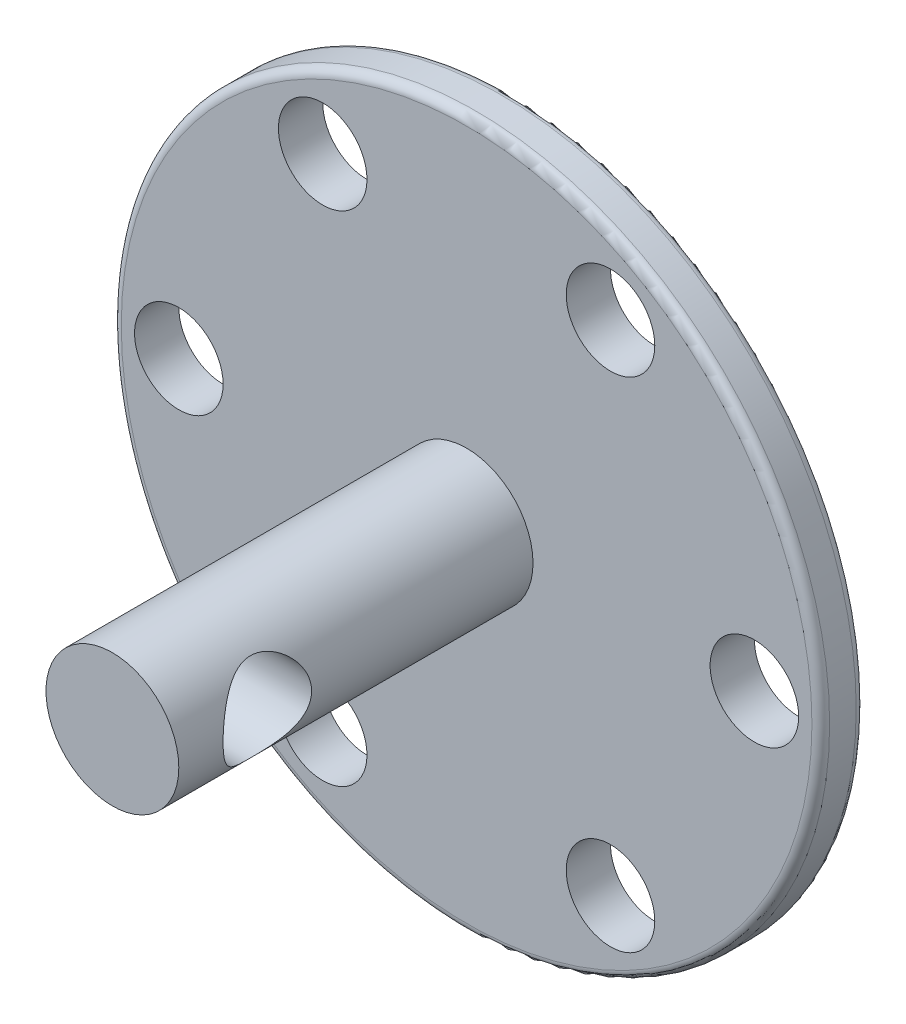
ISO-10303-21;
HEADER;
FILE_DESCRIPTION(('STEP AP214'),'2;1');
FILE_NAME('part.step','',(''),(''),'','','');
FILE_SCHEMA(('AUTOMOTIVE_DESIGN { 1 0 10303 214 1 1 1 1 }'));
ENDSEC;
DATA;
#1=APPLICATION_CONTEXT('core data for automotive mechanical design processes');
#2=APPLICATION_PROTOCOL_DEFINITION('international standard','automotive_design',2000,#1);
#3=PRODUCT_CONTEXT('',#1,'mechanical');
#4=PRODUCT('Part','Part','',(#3));
#5=PRODUCT_RELATED_PRODUCT_CATEGORY('part','',(#4));
#6=PRODUCT_DEFINITION_FORMATION('','',#4);
#7=PRODUCT_DEFINITION_CONTEXT('part definition',#1,'design');
#8=PRODUCT_DEFINITION('design','',#6,#7);
#9=PRODUCT_DEFINITION_SHAPE('','',#8);
#10=(LENGTH_UNIT() NAMED_UNIT(*) SI_UNIT(.MILLI.,.METRE.));
#11=(NAMED_UNIT(*) PLANE_ANGLE_UNIT() SI_UNIT($,.RADIAN.));
#12=(NAMED_UNIT(*) SI_UNIT($,.STERADIAN.) SOLID_ANGLE_UNIT());
#13=UNCERTAINTY_MEASURE_WITH_UNIT(LENGTH_MEASURE(1.E-05),#10,'distance_accuracy_value','');
#14=(GEOMETRIC_REPRESENTATION_CONTEXT(3) GLOBAL_UNCERTAINTY_ASSIGNED_CONTEXT((#13)) GLOBAL_UNIT_ASSIGNED_CONTEXT((#10,
#11,#12)) REPRESENTATION_CONTEXT('',''));
#15=CARTESIAN_POINT('',(0.,0.,0.));
#16=DIRECTION('',(0.,0.,1.));
#17=DIRECTION('',(1.,0.,0.));
#18=AXIS2_PLACEMENT_3D('',#15,#16,#17);
#19=CARTESIAN_POINT('',(0.,0.,10.));
#20=DIRECTION('',(0.,0.,1.));
#21=DIRECTION('',(1.,0.,0.));
#22=AXIS2_PLACEMENT_3D('',#19,#20,#21);
#23=PLANE('',#22);
#24=CARTESIAN_POINT('',(0.,0.,10.));
#25=DIRECTION('',(0.,0.,1.));
#26=DIRECTION('',(1.,0.,0.));
#27=AXIS2_PLACEMENT_3D('',#24,#25,#26);
#28=CIRCLE('',#27,78.);
#29=CARTESIAN_POINT('',(78.,0.,10.));
#30=VERTEX_POINT('',#29);
#31=EDGE_CURVE('E58',#30,#30,#28,.T.);
#32=ORIENTED_EDGE('',*,*,#31,.T.);
#33=EDGE_LOOP('',(#32));
#34=FACE_BOUND('',#33,.T.);
#35=CARTESIAN_POINT('',(0.,0.,9.99999999999999));
#36=DIRECTION('',(0.,0.,1.));
#37=DIRECTION('',(1.,0.,0.));
#38=AXIS2_PLACEMENT_3D('',#35,#36,#37);
#39=CIRCLE('',#38,15.);
#40=CARTESIAN_POINT('',(15.,0.,9.99999999999999));
#41=VERTEX_POINT('',#40);
#42=EDGE_CURVE('E259',#41,#41,#39,.F.);
#43=ORIENTED_EDGE('',*,*,#42,.T.);
#44=EDGE_LOOP('',(#43));
#45=FACE_BOUND('',#44,.T.);
#46=CARTESIAN_POINT('',(32.4999999999995,-56.2916512459888,10.));
#47=DIRECTION('',(0.,0.,1.));
#48=DIRECTION('',(1.,0.,0.));
#49=AXIS2_PLACEMENT_3D('',#46,#47,#48);
#50=CIRCLE('',#49,10.);
#51=CARTESIAN_POINT('',(42.4999999999995,-56.2916512459888,10.));
#52=VERTEX_POINT('',#51);
#53=EDGE_CURVE('E268',#52,#52,#50,.T.);
#54=ORIENTED_EDGE('',*,*,#53,.F.);
#55=EDGE_LOOP('',(#54));
#56=FACE_BOUND('',#55,.T.);
#57=CARTESIAN_POINT('',(32.5000000000003,56.2916512459884,10.));
#58=DIRECTION('',(0.,0.,1.));
#59=DIRECTION('',(1.,0.,0.));
#60=AXIS2_PLACEMENT_3D('',#57,#58,#59);
#61=CIRCLE('',#60,10.);
#62=CARTESIAN_POINT('',(42.5000000000003,56.2916512459884,10.));
#63=VERTEX_POINT('',#62);
#64=EDGE_CURVE('E284',#63,#63,#61,.T.);
#65=ORIENTED_EDGE('',*,*,#64,.F.);
#66=EDGE_LOOP('',(#65));
#67=FACE_BOUND('',#66,.T.);
#68=CARTESIAN_POINT('',(-65.,0.,10.));
#69=DIRECTION('',(0.,0.,1.));
#70=DIRECTION('',(1.,0.,0.));
#71=AXIS2_PLACEMENT_3D('',#68,#69,#70);
#72=CIRCLE('',#71,10.);
#73=CARTESIAN_POINT('',(-55.,0.,10.));
#74=VERTEX_POINT('',#73);
#75=EDGE_CURVE('E64',#74,#74,#72,.T.);
#76=ORIENTED_EDGE('',*,*,#75,.F.);
#77=EDGE_LOOP('',(#76));
#78=FACE_BOUND('',#77,.T.);
#79=CARTESIAN_POINT('',(-32.4999999999999,56.2916512459886,10.));
#80=DIRECTION('',(0.,0.,1.));
#81=DIRECTION('',(1.,0.,0.));
#82=AXIS2_PLACEMENT_3D('',#79,#80,#81);
#83=CIRCLE('',#82,10.);
#84=CARTESIAN_POINT('',(-22.4999999999999,56.2916512459886,10.));
#85=VERTEX_POINT('',#84);
#86=EDGE_CURVE('E292',#85,#85,#83,.T.);
#87=ORIENTED_EDGE('',*,*,#86,.F.);
#88=EDGE_LOOP('',(#87));
#89=FACE_BOUND('',#88,.T.);
#90=CARTESIAN_POINT('',(65.,-4.45932369855149E-13,10.));
#91=DIRECTION('',(0.,0.,1.));
#92=DIRECTION('',(1.,0.,0.));
#93=AXIS2_PLACEMENT_3D('',#90,#91,#92);
#94=CIRCLE('',#93,10.);
#95=CARTESIAN_POINT('',(75.,-4.45932369855149E-13,10.));
#96=VERTEX_POINT('',#95);
#97=EDGE_CURVE('E276',#96,#96,#94,.T.);
#98=ORIENTED_EDGE('',*,*,#97,.F.);
#99=EDGE_LOOP('',(#98));
#100=FACE_BOUND('',#99,.T.);
#101=CARTESIAN_POINT('',(-32.5000000000007,-56.2916512459882,10.));
#102=DIRECTION('',(0.,0.,1.));
#103=DIRECTION('',(1.,0.,0.));
#104=AXIS2_PLACEMENT_3D('',#101,#102,#103);
#105=CIRCLE('',#104,10.);
#106=CARTESIAN_POINT('',(-22.5000000000006,-56.2916512459882,10.));
#107=VERTEX_POINT('',#106);
#108=EDGE_CURVE('E253',#107,#107,#105,.T.);
#109=ORIENTED_EDGE('',*,*,#108,.F.);
#110=EDGE_LOOP('',(#109));
#111=FACE_BOUND('',#110,.T.);
#112=ADVANCED_FACE('F40',(#34,#45,#56,#67,#78,#89,#100,#111),#23,.T.);
#113=CARTESIAN_POINT('',(0.,0.,0.));
#114=DIRECTION('',(0.,0.,1.));
#115=DIRECTION('',(1.,0.,0.));
#116=AXIS2_PLACEMENT_3D('',#113,#114,#115);
#117=PLANE('',#116);
#118=CARTESIAN_POINT('',(0.,0.,0.));
#119=DIRECTION('',(0.,0.,1.));
#120=DIRECTION('',(1.,0.,0.));
#121=AXIS2_PLACEMENT_3D('',#118,#119,#120);
#122=CIRCLE('',#121,78.);
#123=CARTESIAN_POINT('',(78.,0.,0.));
#124=VERTEX_POINT('',#123);
#125=EDGE_CURVE('E10',#124,#124,#122,.F.);
#126=ORIENTED_EDGE('',*,*,#125,.T.);
#127=EDGE_LOOP('',(#126));
#128=FACE_BOUND('',#127,.T.);
#129=CARTESIAN_POINT('',(-65.,0.,0.));
#130=DIRECTION('',(0.,0.,1.));
#131=DIRECTION('',(1.,0.,0.));
#132=AXIS2_PLACEMENT_3D('',#129,#130,#131);
#133=CIRCLE('',#132,10.);
#134=CARTESIAN_POINT('',(-55.,0.,0.));
#135=VERTEX_POINT('',#134);
#136=EDGE_CURVE('E296',#135,#135,#133,.T.);
#137=ORIENTED_EDGE('',*,*,#136,.T.);
#138=EDGE_LOOP('',(#137));
#139=FACE_BOUND('',#138,.T.);
#140=CARTESIAN_POINT('',(-32.4999999999999,56.2916512459886,0.));
#141=DIRECTION('',(0.,0.,1.));
#142=DIRECTION('',(1.,0.,0.));
#143=AXIS2_PLACEMENT_3D('',#140,#141,#142);
#144=CIRCLE('',#143,10.);
#145=CARTESIAN_POINT('',(-22.4999999999999,56.2916512459886,0.));
#146=VERTEX_POINT('',#145);
#147=EDGE_CURVE('E288',#146,#146,#144,.T.);
#148=ORIENTED_EDGE('',*,*,#147,.T.);
#149=EDGE_LOOP('',(#148));
#150=FACE_BOUND('',#149,.T.);
#151=CARTESIAN_POINT('',(32.5000000000003,56.2916512459884,0.));
#152=DIRECTION('',(0.,0.,1.));
#153=DIRECTION('',(1.,0.,0.));
#154=AXIS2_PLACEMENT_3D('',#151,#152,#153);
#155=CIRCLE('',#154,10.);
#156=CARTESIAN_POINT('',(42.5000000000003,56.2916512459884,0.));
#157=VERTEX_POINT('',#156);
#158=EDGE_CURVE('E280',#157,#157,#155,.T.);
#159=ORIENTED_EDGE('',*,*,#158,.T.);
#160=EDGE_LOOP('',(#159));
#161=FACE_BOUND('',#160,.T.);
#162=CARTESIAN_POINT('',(65.,-4.45932369855149E-13,0.));
#163=DIRECTION('',(0.,0.,1.));
#164=DIRECTION('',(1.,0.,0.));
#165=AXIS2_PLACEMENT_3D('',#162,#163,#164);
#166=CIRCLE('',#165,10.);
#167=CARTESIAN_POINT('',(75.,-4.45932369855149E-13,0.));
#168=VERTEX_POINT('',#167);
#169=EDGE_CURVE('E272',#168,#168,#166,.T.);
#170=ORIENTED_EDGE('',*,*,#169,.T.);
#171=EDGE_LOOP('',(#170));
#172=FACE_BOUND('',#171,.T.);
#173=CARTESIAN_POINT('',(32.4999999999995,-56.2916512459888,0.));
#174=DIRECTION('',(0.,0.,1.));
#175=DIRECTION('',(1.,0.,0.));
#176=AXIS2_PLACEMENT_3D('',#173,#174,#175);
#177=CIRCLE('',#176,10.);
#178=CARTESIAN_POINT('',(42.4999999999995,-56.2916512459888,0.));
#179=VERTEX_POINT('',#178);
#180=EDGE_CURVE('E263',#179,#179,#177,.T.);
#181=ORIENTED_EDGE('',*,*,#180,.T.);
#182=EDGE_LOOP('',(#181));
#183=FACE_BOUND('',#182,.T.);
#184=CARTESIAN_POINT('',(-32.5000000000007,-56.2916512459882,0.));
#185=DIRECTION('',(0.,0.,1.));
#186=DIRECTION('',(1.,0.,0.));
#187=AXIS2_PLACEMENT_3D('',#184,#185,#186);
#188=CIRCLE('',#187,10.);
#189=CARTESIAN_POINT('',(-22.5000000000006,-56.2916512459882,0.));
#190=VERTEX_POINT('',#189);
#191=EDGE_CURVE('E256',#190,#190,#188,.T.);
#192=ORIENTED_EDGE('',*,*,#191,.T.);
#193=EDGE_LOOP('',(#192));
#194=FACE_BOUND('',#193,.T.);
#195=ADVANCED_FACE('F100',(#128,#139,#150,#161,#172,#183,#194),#117,.F.);
#196=CARTESIAN_POINT('',(0.,0.,10.));
#197=DIRECTION('',(0.,0.,-1.));
#198=DIRECTION('',(-1.,0.,0.));
#199=AXIS2_PLACEMENT_3D('',#196,#197,#198);
#200=CYLINDRICAL_SURFACE('',#199,80.);
#201=CARTESIAN_POINT('',(0.,0.,8.));
#202=DIRECTION('',(0.,0.,1.));
#203=DIRECTION('',(1.,0.,0.));
#204=AXIS2_PLACEMENT_3D('',#201,#202,#203);
#205=CIRCLE('',#204,80.);
#206=CARTESIAN_POINT('',(80.,0.,8.));
#207=VERTEX_POINT('',#206);
#208=EDGE_CURVE('E48',#207,#207,#205,.F.);
#209=ORIENTED_EDGE('',*,*,#208,.T.);
#210=EDGE_LOOP('',(#209));
#211=FACE_BOUND('',#210,.T.);
#212=CARTESIAN_POINT('',(0.,0.,2.));
#213=DIRECTION('',(0.,0.,1.));
#214=DIRECTION('',(1.,0.,0.));
#215=AXIS2_PLACEMENT_3D('',#212,#213,#214);
#216=CIRCLE('',#215,80.);
#217=CARTESIAN_POINT('',(80.,0.,2.));
#218=VERTEX_POINT('',#217);
#219=EDGE_CURVE('E53',#218,#218,#216,.T.);
#220=ORIENTED_EDGE('',*,*,#219,.T.);
#221=EDGE_LOOP('',(#220));
#222=FACE_BOUND('',#221,.T.);
#223=ADVANCED_FACE('F107',(#211,#222),#200,.T.);
#224=CARTESIAN_POINT('',(-65.,0.,10.));
#225=DIRECTION('',(0.,0.,-1.));
#226=DIRECTION('',(-1.,0.,0.));
#227=AXIS2_PLACEMENT_3D('',#224,#225,#226);
#228=CYLINDRICAL_SURFACE('',#227,10.);
#229=ORIENTED_EDGE('',*,*,#75,.T.);
#230=EDGE_LOOP('',(#229));
#231=FACE_BOUND('',#230,.T.);
#232=ORIENTED_EDGE('',*,*,#136,.F.);
#233=EDGE_LOOP('',(#232));
#234=FACE_BOUND('',#233,.T.);
#235=ADVANCED_FACE('F111',(#231,#234),#228,.F.);
#236=CARTESIAN_POINT('',(-32.4999999999999,56.2916512459886,10.));
#237=DIRECTION('',(0.,0.,-1.));
#238=DIRECTION('',(-1.,0.,0.));
#239=AXIS2_PLACEMENT_3D('',#236,#237,#238);
#240=CYLINDRICAL_SURFACE('',#239,10.);
#241=ORIENTED_EDGE('',*,*,#86,.T.);
#242=EDGE_LOOP('',(#241));
#243=FACE_BOUND('',#242,.T.);
#244=ORIENTED_EDGE('',*,*,#147,.F.);
#245=EDGE_LOOP('',(#244));
#246=FACE_BOUND('',#245,.T.);
#247=ADVANCED_FACE('F166',(#243,#246),#240,.F.);
#248=CARTESIAN_POINT('',(32.5000000000003,56.2916512459884,10.));
#249=DIRECTION('',(0.,0.,-1.));
#250=DIRECTION('',(-1.,0.,0.));
#251=AXIS2_PLACEMENT_3D('',#248,#249,#250);
#252=CYLINDRICAL_SURFACE('',#251,10.);
#253=ORIENTED_EDGE('',*,*,#64,.T.);
#254=EDGE_LOOP('',(#253));
#255=FACE_BOUND('',#254,.T.);
#256=ORIENTED_EDGE('',*,*,#158,.F.);
#257=EDGE_LOOP('',(#256));
#258=FACE_BOUND('',#257,.T.);
#259=ADVANCED_FACE('F175',(#255,#258),#252,.F.);
#260=CARTESIAN_POINT('',(65.,-4.45932369855149E-13,10.));
#261=DIRECTION('',(0.,0.,-1.));
#262=DIRECTION('',(-1.,0.,0.));
#263=AXIS2_PLACEMENT_3D('',#260,#261,#262);
#264=CYLINDRICAL_SURFACE('',#263,10.);
#265=ORIENTED_EDGE('',*,*,#97,.T.);
#266=EDGE_LOOP('',(#265));
#267=FACE_BOUND('',#266,.T.);
#268=ORIENTED_EDGE('',*,*,#169,.F.);
#269=EDGE_LOOP('',(#268));
#270=FACE_BOUND('',#269,.T.);
#271=ADVANCED_FACE('F184',(#267,#270),#264,.F.);
#272=CARTESIAN_POINT('',(32.4999999999995,-56.2916512459888,10.));
#273=DIRECTION('',(0.,0.,-1.));
#274=DIRECTION('',(-1.,0.,0.));
#275=AXIS2_PLACEMENT_3D('',#272,#273,#274);
#276=CYLINDRICAL_SURFACE('',#275,10.);
#277=ORIENTED_EDGE('',*,*,#53,.T.);
#278=EDGE_LOOP('',(#277));
#279=FACE_BOUND('',#278,.T.);
#280=ORIENTED_EDGE('',*,*,#180,.F.);
#281=EDGE_LOOP('',(#280));
#282=FACE_BOUND('',#281,.T.);
#283=ADVANCED_FACE('F194',(#279,#282),#276,.F.);
#284=CARTESIAN_POINT('',(-32.5000000000007,-56.2916512459882,10.));
#285=DIRECTION('',(0.,0.,-1.));
#286=DIRECTION('',(-1.,0.,0.));
#287=AXIS2_PLACEMENT_3D('',#284,#285,#286);
#288=CYLINDRICAL_SURFACE('',#287,10.);
#289=ORIENTED_EDGE('',*,*,#108,.T.);
#290=EDGE_LOOP('',(#289));
#291=FACE_BOUND('',#290,.T.);
#292=ORIENTED_EDGE('',*,*,#191,.F.);
#293=EDGE_LOOP('',(#292));
#294=FACE_BOUND('',#293,.T.);
#295=ADVANCED_FACE('F96',(#291,#294),#288,.F.);
#296=CARTESIAN_POINT('',(0.,0.,90.));
#297=DIRECTION('',(0.,0.,-1.));
#298=DIRECTION('',(-1.,0.,0.));
#299=AXIS2_PLACEMENT_3D('',#296,#297,#298);
#300=CYLINDRICAL_SURFACE('',#299,15.);
#301=CARTESIAN_POINT('',(-15.,0.,80.));
#302=CARTESIAN_POINT('',(-14.9999999330355,-0.25121602505803,79.9999999353495));
#303=CARTESIAN_POINT('',(-14.9936756382587,-0.50243329641179,79.9905209450216));
#304=CARTESIAN_POINT('',(-14.968537725491,-1.00281430621742,79.9527543540569));
#305=CARTESIAN_POINT('',(-14.949724041765,-1.25197803385393,79.9244666544247));
#306=CARTESIAN_POINT('',(-14.900062607298,-1.74639437147615,79.8495001443495));
#307=CARTESIAN_POINT('',(-14.8692101655419,-1.99164541802644,79.8028141647734));
#308=CARTESIAN_POINT('',(-14.7962049328406,-2.47636835109205,79.691719760387));
#309=CARTESIAN_POINT('',(-14.7540520052543,-2.71584016768893,79.6273111212808));
#310=CARTESIAN_POINT('',(-14.6596225678735,-3.18634157579506,79.4819602405573));
#311=CARTESIAN_POINT('',(-14.6073953835842,-3.41740603302261,79.4010984550164));
#312=CARTESIAN_POINT('',(-14.4937836667137,-3.87103535608822,79.2235793171626));
#313=CARTESIAN_POINT('',(-14.4323991815098,-4.09360026589292,79.1269220465706));
#314=CARTESIAN_POINT('',(-14.3016824454347,-4.52919238259837,78.9187823438108));
#315=CARTESIAN_POINT('',(-14.2323514695008,-4.74222111188153,78.8073022893566));
#316=CARTESIAN_POINT('',(-14.086975078723,-5.15806897823306,78.5703919232153));
#317=CARTESIAN_POINT('',(-14.0109271670256,-5.36088427435107,78.4449564194008));
#318=CARTESIAN_POINT('',(-13.846795493068,-5.77229179252597,78.169880107123));
#319=CARTESIAN_POINT('',(-13.7582376430911,-5.97992610161556,78.0190898124267));
#320=CARTESIAN_POINT('',(-13.5764689970333,-6.38186231730969,77.7030661181971));
#321=CARTESIAN_POINT('',(-13.4832562003888,-6.57615840484503,77.5378264854341));
#322=CARTESIAN_POINT('',(-13.2938516889865,-6.95109161684714,77.1935518264848));
#323=CARTESIAN_POINT('',(-13.1976561722971,-7.13171020600087,77.0144987209747));
#324=CARTESIAN_POINT('',(-13.0042893469472,-7.47849345473134,76.6435373382512));
#325=CARTESIAN_POINT('',(-12.9071183637111,-7.64466276695229,76.4516332345341));
#326=CARTESIAN_POINT('',(-12.6984183321707,-7.98727084465364,76.0241138153235));
#327=CARTESIAN_POINT('',(-12.5870482743966,-8.16117931320374,75.7863846756156));
#328=CARTESIAN_POINT('',(-12.3688469609622,-8.48824389065339,75.2949828836546));
#329=CARTESIAN_POINT('',(-12.2620167396837,-8.64139528736315,75.0413066302189));
#330=CARTESIAN_POINT('',(-12.0567536678672,-8.92554542356294,74.5191637706027));
#331=CARTESIAN_POINT('',(-11.958307425287,-9.05657983313836,74.2507219237275));
#332=CARTESIAN_POINT('',(-11.7736552489426,-9.29536686554369,73.6995014922921));
#333=CARTESIAN_POINT('',(-11.6874497570146,-9.40311864804829,73.416722390721));
#334=CARTESIAN_POINT('',(-11.554164407184,-9.56603073076104,72.9219751266934));
#335=CARTESIAN_POINT('',(-11.5029747857298,-9.62739262612925,72.7131395869155));
#336=CARTESIAN_POINT('',(-11.4105753109273,-9.73672940324514,72.289937274223));
#337=CARTESIAN_POINT('',(-11.3693590511558,-9.784712881697,72.0755741504336));
#338=CARTESIAN_POINT('',(-11.2983421435493,-9.86663115695274,71.6425809785492));
#339=CARTESIAN_POINT('',(-11.2685273567868,-9.90058335814109,71.4239565709598));
#340=CARTESIAN_POINT('',(-11.221387591901,-9.95398099415626,70.9835887309119));
#341=CARTESIAN_POINT('',(-11.2040626822259,-9.97342634948116,70.7618452813668));
#342=CARTESIAN_POINT('',(-11.1825789027742,-9.99750949727822,70.3159869025666));
#343=CARTESIAN_POINT('',(-11.1784748508786,-10.0020856379335,70.0918659554354));
#344=CARTESIAN_POINT('',(-11.1837650844345,-9.9961699136916,69.6439846703282));
#345=CARTESIAN_POINT('',(-11.1931594157374,-9.98567799761094,69.4202243335797));
#346=CARTESIAN_POINT('',(-11.2250543429254,-9.94981025476011,68.9746874522769));
#347=CARTESIAN_POINT('',(-11.2475646772114,-9.92442336863968,68.7529125062035));
#348=CARTESIAN_POINT('',(-11.3047790826166,-9.85920094420809,68.313112536714));
#349=CARTESIAN_POINT('',(-11.3394833862946,-9.81936513033175,68.0950875848997));
#350=CARTESIAN_POINT('',(-11.4180019094514,-9.72793320006853,67.6736922309987));
#351=CARTESIAN_POINT('',(-11.4613417591393,-9.67693962238988,67.4701015448694));
#352=CARTESIAN_POINT('',(-11.5566568857338,-9.56290804839144,67.068372877524));
#353=CARTESIAN_POINT('',(-11.6086351042463,-9.49986594811239,66.8702367806307));
#354=CARTESIAN_POINT('',(-11.7754502619445,-9.29354494113033,66.2850346702939));
#355=CARTESIAN_POINT('',(-11.9012104503488,-9.13302364641689,65.9069591042848));
#356=CARTESIAN_POINT('',(-12.1171285127346,-8.84272153741116,65.323856241402));
#357=CARTESIAN_POINT('',(-12.2015387549069,-8.72612786560377,65.1098373489877));
#358=CARTESIAN_POINT('',(-12.3748717362542,-8.47852404512044,64.6921259467745));
#359=CARTESIAN_POINT('',(-12.4637949008305,-8.34751253601215,64.4884344140937));
#360=CARTESIAN_POINT('',(-12.6442740511078,-8.07152743445187,64.0916213405095));
#361=CARTESIAN_POINT('',(-12.7358328434522,-7.92653854045353,63.8985117550921));
#362=CARTESIAN_POINT('',(-12.9196994873306,-7.6231772391138,63.5234781012259));
#363=CARTESIAN_POINT('',(-13.0120073783843,-7.46480412146616,63.341554627315));
#364=CARTESIAN_POINT('',(-13.2155248866167,-7.099474194883,62.9513484019406));
#365=CARTESIAN_POINT('',(-13.326515197775,-6.88940798266189,62.7458483161932));
#366=CARTESIAN_POINT('',(-13.5442982668685,-6.45073383646428,62.3531243284252));
#367=CARTESIAN_POINT('',(-13.6510902499499,-6.22212250338514,62.1659037907511));
#368=CARTESIAN_POINT('',(-13.8576700674927,-5.74734305844847,61.8112408388158));
#369=CARTESIAN_POINT('',(-13.9574630115838,-5.5011880246902,61.6437839338813));
#370=CARTESIAN_POINT('',(-14.1474838136551,-4.99223677264769,61.3301173923021));
#371=CARTESIAN_POINT('',(-14.2377143016267,-4.72944516189958,61.1839019094408));
#372=CARTESIAN_POINT('',(-14.3895846157167,-4.241665312195,60.940900865899));
#373=CARTESIAN_POINT('',(-14.4533619463413,-4.01936273392655,60.8400440204838));
#374=CARTESIAN_POINT('',(-14.5718625564463,-3.56590868996931,60.6541823551828));
#375=CARTESIAN_POINT('',(-14.6265875379369,-3.33475889780841,60.5691745549983));
#376=CARTESIAN_POINT('',(-14.7258138746381,-2.86496136705683,60.4160031036509));
#377=CARTESIAN_POINT('',(-14.7703217334326,-2.62631850868931,60.3478287352716));
#378=CARTESIAN_POINT('',(-14.8481652748998,-2.14287716114344,60.2291238039742));
#379=CARTESIAN_POINT('',(-14.88150078571,-1.89807857733482,60.1785935124717));
#380=CARTESIAN_POINT('',(-14.9363289474097,-1.40298657198257,60.0957133431218));
#381=CARTESIAN_POINT('',(-14.9577691603099,-1.1526737995994,60.0634439524512));
#382=CARTESIAN_POINT('',(-14.988047801091,-0.649559957245926,60.0179227238064));
#383=CARTESIAN_POINT('',(-14.9968862125054,-0.396758884024651,60.0046709106821));
#384=CARTESIAN_POINT('',(-15.0017358975792,0.109232368114855,59.9973959835425));
#385=CARTESIAN_POINT('',(-14.9977476999263,0.362422530565635,60.0033720769905));
#386=CARTESIAN_POINT('',(-14.9770466614902,0.867090784232954,60.0344562723816));
#387=CARTESIAN_POINT('',(-14.9603343637986,1.11856894805902,60.0595635577651));
#388=CARTESIAN_POINT('',(-14.9162207256747,1.60021088099168,60.1260843649813));
#389=CARTESIAN_POINT('',(-14.8896545033154,1.83062905444838,60.1662258257587));
#390=CARTESIAN_POINT('',(-14.8264553228871,2.28675079168799,60.2621829460635));
#391=CARTESIAN_POINT('',(-14.7898229314375,2.51245462006971,60.3179977233518));
#392=CARTESIAN_POINT('',(-14.7072292872384,2.95782054801538,60.4446404619179));
#393=CARTESIAN_POINT('',(-14.6612689972306,3.17748326843353,60.5154668738632));
#394=CARTESIAN_POINT('',(-14.5608685744981,3.609760336539,60.6714173751423));
#395=CARTESIAN_POINT('',(-14.5064251426564,3.82237190283184,60.7565470280585));
#396=CARTESIAN_POINT('',(-14.3865364468578,4.25209030381564,60.9458234001798));
#397=CARTESIAN_POINT('',(-14.3206265538465,4.46869902215189,61.0508056922133));
#398=CARTESIAN_POINT('',(-14.1815800238228,4.89208194000024,61.2750386052661));
#399=CARTESIAN_POINT('',(-14.1084403642545,5.0988519722715,61.3942951983881));
#400=CARTESIAN_POINT('',(-13.9562209237832,5.50184549515241,61.6461879095976));
#401=CARTESIAN_POINT('',(-13.877139647821,5.69806630986325,61.7788273980544));
#402=CARTESIAN_POINT('',(-13.7143680858164,6.07939950359022,62.0566652164583));
#403=CARTESIAN_POINT('',(-13.6306772864208,6.26451064052811,62.2018649462449));
#404=CARTESIAN_POINT('',(-13.4465269082311,6.6516032569235,62.5280538027898));
#405=CARTESIAN_POINT('',(-13.3455103320206,6.85161533719512,62.7110695310914));
#406=CARTESIAN_POINT('',(-13.1413134709237,7.23554778501399,63.0920352038254));
#407=CARTESIAN_POINT('',(-13.0381336512596,7.41947156934853,63.2899819605356));
#408=CARTESIAN_POINT('',(-12.831786990914,7.77089399542675,63.7002988240268));
#409=CARTESIAN_POINT('',(-12.7286202362013,7.93837850837233,63.9126810767084));
#410=CARTESIAN_POINT('',(-12.5248630730048,8.25611378856013,64.3511176960579));
#411=CARTESIAN_POINT('',(-12.4242724021863,8.40636631608099,64.5771706626281));
#412=CARTESIAN_POINT('',(-12.2366511518776,8.67693135617692,65.0227586253773));
#413=CARTESIAN_POINT('',(-12.1491931829413,8.798701217252,65.2412285146246));
#414=CARTESIAN_POINT('',(-11.9809703622396,9.02642731767801,65.68877739975));
#415=CARTESIAN_POINT('',(-11.9002056074433,9.13238332794099,65.9178565492565));
#416=CARTESIAN_POINT('',(-11.7479595311078,9.32741855584938,66.3856692864232));
#417=CARTESIAN_POINT('',(-11.6764646765776,9.4165224648861,66.6243881175329));
#418=CARTESIAN_POINT('',(-11.5452295677016,9.57697422267287,67.1108625978112));
#419=CARTESIAN_POINT('',(-11.4854866126081,9.64832615207155,67.3586161551253));
#420=CARTESIAN_POINT('',(-11.3897704831431,9.76102279918068,67.8165171636202));
#421=CARTESIAN_POINT('',(-11.3514548915623,9.80545611371607,68.0254171822823));
#422=CARTESIAN_POINT('',(-11.2857234393171,9.88104071134551,68.4472831754927));
#423=CARTESIAN_POINT('',(-11.2583053708654,9.91219468486488,68.6602483172938));
#424=CARTESIAN_POINT('',(-11.2153901131429,9.96072687389686,69.0887544010096));
#425=CARTESIAN_POINT('',(-11.1998824275471,9.97811721936676,69.3042929045431));
#426=CARTESIAN_POINT('',(-11.1813575884869,9.99887192737887,69.7365905067501));
#427=CARTESIAN_POINT('',(-11.1783406173109,10.0022360852241,69.953349623191));
#428=CARTESIAN_POINT('',(-11.1849224927768,9.99487528285886,70.3865576421458));
#429=CARTESIAN_POINT('',(-11.1945285412991,9.98414227971975,70.6030062969761));
#430=CARTESIAN_POINT('',(-11.2259822212761,9.94876260555887,71.0338513127226));
#431=CARTESIAN_POINT('',(-11.2478297523767,9.92411604859886,71.2482476904484));
#432=CARTESIAN_POINT('',(-11.3029581148717,9.86128176273313,71.6737436673172));
#433=CARTESIAN_POINT('',(-11.3362494199346,9.82308162817279,71.8848400605356));
#434=CARTESIAN_POINT('',(-11.4131107403506,9.73367199559206,72.3024487680664));
#435=CARTESIAN_POINT('',(-11.4566866343157,9.68245505594956,72.5089583864671));
#436=CARTESIAN_POINT('',(-11.5655388267535,9.55234495109753,72.9706068817912));
#437=CARTESIAN_POINT('',(-11.6335040156423,9.46971376976683,73.2240627037933));
#438=CARTESIAN_POINT('',(-11.7808083684513,9.28581809630263,73.7207212709719));
#439=CARTESIAN_POINT('',(-11.8601514566957,9.18454717174898,73.9639204409432));
#440=CARTESIAN_POINT('',(-12.0274247462764,8.96438401317387,74.4394298982427));
#441=CARTESIAN_POINT('',(-12.1153637978473,8.84547355124955,74.6717285907088));
#442=CARTESIAN_POINT('',(-12.2970901291272,8.59104253624865,75.1245924907115));
#443=CARTESIAN_POINT('',(-12.3908770998534,8.45552286037769,75.3451583170307));
#444=CARTESIAN_POINT('',(-12.5835943779112,8.16602291524329,75.7779814169915));
#445=CARTESIAN_POINT('',(-12.6825868303729,8.01175463180858,75.9900181135007));
#446=CARTESIAN_POINT('',(-12.8818233284634,7.68731964794005,76.4010700860617));
#447=CARTESIAN_POINT('',(-12.9820678307752,7.51714699045039,76.6000804351965));
#448=CARTESIAN_POINT('',(-13.1816297875113,7.16144037138928,76.9844354950966));
#449=CARTESIAN_POINT('',(-13.2809471060737,6.97590419669872,77.1697782297428));
#450=CARTESIAN_POINT('',(-13.4766033774272,6.58999024940346,77.5260207576439));
#451=CARTESIAN_POINT('',(-13.5729423603127,6.38961262683214,77.6969206968648));
#452=CARTESIAN_POINT('',(-13.7742163705596,5.94464767383283,78.0468864178101));
#453=CARTESIAN_POINT('',(-13.8783939266356,5.69784749774642,78.2235894099854));
#454=CARTESIAN_POINT('',(-14.0774919665113,5.18647351593625,78.5553127015469));
#455=CARTESIAN_POINT('',(-14.1724111000986,4.92189712727175,78.710329839779));
#456=CARTESIAN_POINT('',(-14.3501334769257,4.37672916893081,78.9966052188981));
#457=CARTESIAN_POINT('',(-14.4329515653996,4.09615781925747,79.1278926184773));
#458=CARTESIAN_POINT('',(-14.5840038038844,3.52068543509655,79.364908653792));
#459=CARTESIAN_POINT('',(-14.6522430743996,3.22578947664132,79.4706462650709));
#460=CARTESIAN_POINT('',(-14.7585526216257,2.69111020627907,79.6342001425005));
#461=CARTESIAN_POINT('',(-14.7999572935386,2.45363501782299,79.6974438948679));
#462=CARTESIAN_POINT('',(-14.8716476970084,1.9730858114812,79.8065080818939));
#463=CARTESIAN_POINT('',(-14.9019355596521,1.73001287618555,79.8523318560137));
#464=CARTESIAN_POINT('',(-14.9506744441808,1.24011776126902,79.9258966801066));
#465=CARTESIAN_POINT('',(-14.9691325832632,0.993297927604427,79.9536486029329));
#466=CARTESIAN_POINT('',(-14.993795624143,0.497652520116118,79.9907006409564));
#467=CARTESIAN_POINT('',(-15.0000000663276,0.248826871409571,80.0000000640356));
#468=CARTESIAN_POINT('',(-15.,0.,80.));
#469=B_SPLINE_CURVE_WITH_KNOTS('',3,(#301,#302,#303,#304,#305,#306,#307,#308,#309,#310,#311,
#312,#313,#314,#315,#316,#317,#318,#319,#320,#321,#322,#323,#324,#325,#326,#327,#328,#329,#330,
#331,#332,#333,#334,#335,#336,#337,#338,#339,#340,#341,#342,#343,#344,#345,#346,#347,#348,#349,
#350,#351,#352,#353,#354,#355,#356,#357,#358,#359,#360,#361,#362,#363,#364,#365,#366,#367,#368,
#369,#370,#371,#372,#373,#374,#375,#376,#377,#378,#379,#380,#381,#382,#383,#384,#385,#386,#387,
#388,#389,#390,#391,#392,#393,#394,#395,#396,#397,#398,#399,#400,#401,#402,#403,#404,#405,#406,
#407,#408,#409,#410,#411,#412,#413,#414,#415,#416,#417,#418,#419,#420,#421,#422,#423,#424,#425,
#426,#427,#428,#429,#430,#431,#432,#433,#434,#435,#436,#437,#438,#439,#440,#441,#442,#443,#444,
#445,#446,#447,#448,#449,#450,#451,#452,#453,#454,#455,#456,#457,#458,#459,#460,#461,#462,#463,
#464,#465,#466,#467,#468),.UNSPECIFIED.,.T.,.F.,(4,2,2,2,2,2,2,2,2,2,2,2,2,2,2,2,2,2,2,2,2,2,2,
2,2,2,2,2,2,2,2,2,2,2,2,2,2,2,2,2,2,2,2,2,2,2,2,2,2,2,2,2,2,2,2,2,2,2,2,2,2,2,2,2,2,2,2,2,2,2,2,
2,2,2,2,2,2,2,2,2,2,2,2,4),(0.,0.753394300185716,1.50679256573076,2.2604846936234,
3.0141859352887,3.76428651453101,4.51438321311106,5.26435973397234,6.01461622276406,
6.82821436912436,7.64216523759397,8.45720010773052,9.27197155852477,10.2155659725767,
11.1593742402419,12.1016454881405,13.0439507391687,13.7141436311146,14.3839048726875,
15.0528328312319,15.7217644556782,16.3934661372619,17.0651701004973,17.7373734287591,
18.4095895777342,19.0518780381327,19.694385665547,20.9787317460437,21.7519790573574,
22.5252993930816,23.2994761376386,24.0736939939054,25.0149715434141,25.9564220095439,
26.8971778596538,27.8376742956462,28.5938374823541,29.3498583343056,30.1053966077372,
30.8609465029599,31.6198011453589,32.3786567793353,33.1374811351664,33.896273104583,
34.6016588818499,35.3070049614494,36.0122782785612,36.7178265661455,37.4657892549015,
38.2140659784521,38.9625316217945,39.7110807894034,40.5781485096025,41.4450316350127,
42.3126534000335,43.1801864568224,43.9743636862577,44.7685524194551,45.5615683509502,
46.3544018230503,47.0046896349387,47.6548456343111,48.3044280077778,48.9540198611609,
49.6039824906945,50.2539397919853,50.9044935435747,51.5554200523821,52.3795636043219,
53.2039920963941,54.0292785280237,54.8545213914148,55.6945962643172,56.534987061841,
57.3754991292032,58.2160027009215,59.1774341078251,60.1390055171883,61.0993872102032,
62.0594310326874,62.8062251677098,63.5528760678118,64.2990773324883,65.045306585219),.UNSPECIFIED.);
#470=CARTESIAN_POINT('',(-15.,0.,80.));
#471=VERTEX_POINT('',#470);
#472=EDGE_CURVE('E65',#471,#471,#469,.T.);
#473=ORIENTED_EDGE('',*,*,#472,.T.);
#474=EDGE_LOOP('',(#473));
#475=FACE_BOUND('',#474,.T.);
#476=CARTESIAN_POINT('',(15.,0.,60.));
#477=CARTESIAN_POINT('',(14.9999999330355,-0.251216025058028,60.0000000646505));
#478=CARTESIAN_POINT('',(14.9936756382587,-0.502433296411789,60.0094790549784));
#479=CARTESIAN_POINT('',(14.968537725491,-1.00281430621742,60.0472456459431));
#480=CARTESIAN_POINT('',(14.949724041765,-1.25197803385393,60.0755333455753));
#481=CARTESIAN_POINT('',(14.900062607298,-1.74639437147615,60.1504998556505));
#482=CARTESIAN_POINT('',(14.8692101655419,-1.99164541802644,60.1971858352267));
#483=CARTESIAN_POINT('',(14.7962049328406,-2.47636835109205,60.3082802396131));
#484=CARTESIAN_POINT('',(14.7540520052543,-2.71584016768893,60.3726888787192));
#485=CARTESIAN_POINT('',(14.6596225678735,-3.18634157579506,60.5180397594427));
#486=CARTESIAN_POINT('',(14.6073953835842,-3.41740603302261,60.5989015449836));
#487=CARTESIAN_POINT('',(14.4937836667137,-3.87103535608821,60.7764206828374));
#488=CARTESIAN_POINT('',(14.4323991815098,-4.09360026589291,60.8730779534294));
#489=CARTESIAN_POINT('',(14.3016824454347,-4.52919238259836,61.0812176561892));
#490=CARTESIAN_POINT('',(14.2323514695008,-4.74222111188152,61.1926977106434));
#491=CARTESIAN_POINT('',(14.086975078723,-5.15806897823306,61.4296080767847));
#492=CARTESIAN_POINT('',(14.0109271670256,-5.36088427435106,61.5550435805992));
#493=CARTESIAN_POINT('',(13.846795493068,-5.77229179252596,61.830119892877));
#494=CARTESIAN_POINT('',(13.7582376430911,-5.97992610161555,61.9809101875733));
#495=CARTESIAN_POINT('',(13.5764689970333,-6.38186231730969,62.2969338818029));
#496=CARTESIAN_POINT('',(13.4832562003888,-6.57615840484503,62.4621735145659));
#497=CARTESIAN_POINT('',(13.2938516889865,-6.95109161684714,62.8064481735152));
#498=CARTESIAN_POINT('',(13.1976561722972,-7.13171020600087,62.9855012790253));
#499=CARTESIAN_POINT('',(13.0042893469472,-7.47849345473134,63.3564626617488));
#500=CARTESIAN_POINT('',(12.9071183637111,-7.64466276695229,63.5483667654659));
#501=CARTESIAN_POINT('',(12.6984183321707,-7.98727084465365,63.9758861846765));
#502=CARTESIAN_POINT('',(12.5870482743966,-8.16117931320375,64.2136153243844));
#503=CARTESIAN_POINT('',(12.3688469609622,-8.48824389065339,64.7050171163455));
#504=CARTESIAN_POINT('',(12.2620167396837,-8.64139528736315,64.9586933697811));
#505=CARTESIAN_POINT('',(12.0567536678671,-8.92554542356295,65.4808362293973));
#506=CARTESIAN_POINT('',(11.958307425287,-9.05657983313837,65.7492780762725));
#507=CARTESIAN_POINT('',(11.7736552489426,-9.2953668655437,66.3004985077079));
#508=CARTESIAN_POINT('',(11.6874497570146,-9.4031186480483,66.5832776092791));
#509=CARTESIAN_POINT('',(11.554164407184,-9.56603073076105,67.0780248733067));
#510=CARTESIAN_POINT('',(11.5029747857298,-9.62739262612926,67.2868604130845));
#511=CARTESIAN_POINT('',(11.4105753109273,-9.73672940324514,67.710062725777));
#512=CARTESIAN_POINT('',(11.3693590511558,-9.78471288169701,67.9244258495665));
#513=CARTESIAN_POINT('',(11.2983421435493,-9.86663115695275,68.3574190214508));
#514=CARTESIAN_POINT('',(11.2685273567868,-9.90058335814109,68.5760434290402));
#515=CARTESIAN_POINT('',(11.221387591901,-9.95398099415626,69.0164112690882));
#516=CARTESIAN_POINT('',(11.2040626822259,-9.97342634948116,69.2381547186333));
#517=CARTESIAN_POINT('',(11.1825789027742,-9.99750949727822,69.6840130974334));
#518=CARTESIAN_POINT('',(11.1784748508786,-10.0020856379335,69.9081340445646));
#519=CARTESIAN_POINT('',(11.1837650844345,-9.9961699136916,70.3560153296719));
#520=CARTESIAN_POINT('',(11.1931594157374,-9.98567799761094,70.5797756664203));
#521=CARTESIAN_POINT('',(11.2250543429254,-9.94981025476011,71.0253125477231));
#522=CARTESIAN_POINT('',(11.2475646772114,-9.92442336863968,71.2470874937965));
#523=CARTESIAN_POINT('',(11.3047790826166,-9.85920094420808,71.686887463286));
#524=CARTESIAN_POINT('',(11.3394833862946,-9.81936513033175,71.9049124151003));
#525=CARTESIAN_POINT('',(11.4180019094514,-9.72793320006853,72.3263077690013));
#526=CARTESIAN_POINT('',(11.4613417591393,-9.67693962238987,72.5298984551306));
#527=CARTESIAN_POINT('',(11.5566568857338,-9.56290804839144,72.9316271224761));
#528=CARTESIAN_POINT('',(11.6086351042463,-9.49986594811239,73.1297632193693));
#529=CARTESIAN_POINT('',(11.7754502619445,-9.29354494113033,73.7149653297061));
#530=CARTESIAN_POINT('',(11.9012104503488,-9.13302364641689,74.0930408957152));
#531=CARTESIAN_POINT('',(12.1171285127346,-8.84272153741116,74.676143758598));
#532=CARTESIAN_POINT('',(12.2015387549069,-8.72612786560377,74.8901626510124));
#533=CARTESIAN_POINT('',(12.3748717362542,-8.47852404512044,75.3078740532256));
#534=CARTESIAN_POINT('',(12.4637949008305,-8.34751253601214,75.5115655859063));
#535=CARTESIAN_POINT('',(12.6442740511078,-8.07152743445186,75.9083786594905));
#536=CARTESIAN_POINT('',(12.7358328434522,-7.92653854045352,76.1014882449079));
#537=CARTESIAN_POINT('',(12.9196994873306,-7.62317723911379,76.4765218987741));
#538=CARTESIAN_POINT('',(13.0120073783843,-7.46480412146615,76.658445372685));
#539=CARTESIAN_POINT('',(13.2155248866167,-7.09947419488299,77.0486515980595));
#540=CARTESIAN_POINT('',(13.326515197775,-6.88940798266189,77.2541516838068));
#541=CARTESIAN_POINT('',(13.5442982668685,-6.45073383646429,77.6468756715748));
#542=CARTESIAN_POINT('',(13.6510902499499,-6.22212250338514,77.8340962092489));
#543=CARTESIAN_POINT('',(13.8576700674927,-5.74734305844846,78.1887591611842));
#544=CARTESIAN_POINT('',(13.9574630115838,-5.50118802469018,78.3562160661188));
#545=CARTESIAN_POINT('',(14.1474838136551,-4.99223677264768,78.6698826076979));
#546=CARTESIAN_POINT('',(14.2377143016267,-4.72944516189958,78.8160980905592));
#547=CARTESIAN_POINT('',(14.3895846157167,-4.241665312195,79.059099134101));
#548=CARTESIAN_POINT('',(14.4533619463413,-4.01936273392655,79.1599559795162));
#549=CARTESIAN_POINT('',(14.5718625564463,-3.56590868996931,79.3458176448173));
#550=CARTESIAN_POINT('',(14.6265875379369,-3.33475889780841,79.4308254450017));
#551=CARTESIAN_POINT('',(14.7258138746381,-2.86496136705683,79.5839968963491));
#552=CARTESIAN_POINT('',(14.7703217334326,-2.62631850868931,79.6521712647285));
#553=CARTESIAN_POINT('',(14.8481652748998,-2.14287716114344,79.7708761960258));
#554=CARTESIAN_POINT('',(14.88150078571,-1.89807857733482,79.8214064875283));
#555=CARTESIAN_POINT('',(14.9363289474097,-1.40298657198258,79.9042866568782));
#556=CARTESIAN_POINT('',(14.9577691603099,-1.1526737995994,79.9365560475488));
#557=CARTESIAN_POINT('',(14.988047801091,-0.649559957245929,79.9820772761936));
#558=CARTESIAN_POINT('',(14.9968862125054,-0.396758884024654,79.9953290893179));
#559=CARTESIAN_POINT('',(15.0017358975792,0.109232368114853,80.0026040164576));
#560=CARTESIAN_POINT('',(14.9977476999263,0.362422530565633,79.9966279230096));
#561=CARTESIAN_POINT('',(14.9770466614902,0.867090784232951,79.9655437276184));
#562=CARTESIAN_POINT('',(14.9603343637986,1.11856894805902,79.9404364422349));
#563=CARTESIAN_POINT('',(14.9162207256747,1.60021088099167,79.8739156350187));
#564=CARTESIAN_POINT('',(14.8896545033154,1.83062905444837,79.8337741742413));
#565=CARTESIAN_POINT('',(14.8264553228871,2.28675079168799,79.7378170539365));
#566=CARTESIAN_POINT('',(14.7898229314375,2.5124546200697,79.6820022766482));
#567=CARTESIAN_POINT('',(14.7072292872384,2.95782054801538,79.5553595380821));
#568=CARTESIAN_POINT('',(14.6612689972306,3.17748326843353,79.4845331261368));
#569=CARTESIAN_POINT('',(14.5608685744981,3.60976033653899,79.3285826248577));
#570=CARTESIAN_POINT('',(14.5064251426564,3.82237190283184,79.2434529719415));
#571=CARTESIAN_POINT('',(14.3865364468578,4.25209030381564,79.0541765998202));
#572=CARTESIAN_POINT('',(14.3206265538465,4.46869902215189,78.9491943077867));
#573=CARTESIAN_POINT('',(14.1815800238228,4.89208194000024,78.724961394734));
#574=CARTESIAN_POINT('',(14.1084403642545,5.0988519722715,78.6057048016119));
#575=CARTESIAN_POINT('',(13.9562209237832,5.50184549515242,78.3538120904024));
#576=CARTESIAN_POINT('',(13.877139647821,5.69806630986326,78.2211726019456));
#577=CARTESIAN_POINT('',(13.7143680858164,6.07939950359022,77.9433347835417));
#578=CARTESIAN_POINT('',(13.6306772864208,6.26451064052811,77.7981350537551));
#579=CARTESIAN_POINT('',(13.4465269082311,6.6516032569235,77.4719461972102));
#580=CARTESIAN_POINT('',(13.3455103320206,6.85161533719511,77.2889304689086));
#581=CARTESIAN_POINT('',(13.1413134709237,7.23554778501398,76.9079647961747));
#582=CARTESIAN_POINT('',(13.0381336512596,7.41947156934852,76.7100180394644));
#583=CARTESIAN_POINT('',(12.831786990914,7.77089399542674,76.2997011759732));
#584=CARTESIAN_POINT('',(12.7286202362013,7.93837850837232,76.0873189232916));
#585=CARTESIAN_POINT('',(12.5248630730048,8.25611378856013,75.6488823039421));
#586=CARTESIAN_POINT('',(12.4242724021863,8.40636631608099,75.4228293373719));
#587=CARTESIAN_POINT('',(12.2366511518776,8.67693135617691,74.9772413746228));
#588=CARTESIAN_POINT('',(12.1491931829413,8.798701217252,74.7587714853755));
#589=CARTESIAN_POINT('',(11.9809703622396,9.02642731767801,74.3112226002501));
#590=CARTESIAN_POINT('',(11.9002056074433,9.13238332794099,74.0821434507435));
#591=CARTESIAN_POINT('',(11.7479595311078,9.32741855584938,73.6143307135768));
#592=CARTESIAN_POINT('',(11.6764646765776,9.41652246488609,73.3756118824671));
#593=CARTESIAN_POINT('',(11.5452295677016,9.57697422267287,72.8891374021888));
#594=CARTESIAN_POINT('',(11.4854866126081,9.64832615207155,72.6413838448747));
#595=CARTESIAN_POINT('',(11.3897704831431,9.76102279918067,72.1834828363799));
#596=CARTESIAN_POINT('',(11.3514548915623,9.80545611371607,71.9745828177177));
#597=CARTESIAN_POINT('',(11.2857234393171,9.8810407113455,71.5527168245073));
#598=CARTESIAN_POINT('',(11.2583053708654,9.91219468486488,71.3397516827063));
#599=CARTESIAN_POINT('',(11.2153901131429,9.96072687389686,70.9112455989904));
#600=CARTESIAN_POINT('',(11.1998824275471,9.97811721936675,70.6957070954569));
#601=CARTESIAN_POINT('',(11.1813575884869,9.99887192737887,70.2634094932499));
#602=CARTESIAN_POINT('',(11.1783406173109,10.0022360852241,70.0466503768091));
#603=CARTESIAN_POINT('',(11.1849224927768,9.99487528285887,69.6134423578543));
#604=CARTESIAN_POINT('',(11.1945285412991,9.98414227971975,69.396993703024));
#605=CARTESIAN_POINT('',(11.2259822212761,9.94876260555888,68.9661486872775));
#606=CARTESIAN_POINT('',(11.2478297523767,9.92411604859886,68.7517523095516));
#607=CARTESIAN_POINT('',(11.3029581148717,9.86128176273313,68.3262563326829));
#608=CARTESIAN_POINT('',(11.3362494199346,9.82308162817279,68.1151599394644));
#609=CARTESIAN_POINT('',(11.4131107403506,9.73367199559207,67.6975512319337));
#610=CARTESIAN_POINT('',(11.4566866343157,9.68245505594957,67.4910416135329));
#611=CARTESIAN_POINT('',(11.5655388267534,9.55234495109754,67.0293931182088));
#612=CARTESIAN_POINT('',(11.6335040156422,9.46971376976684,66.7759372962068));
#613=CARTESIAN_POINT('',(11.7808083684513,9.28581809630265,66.2792787290282));
#614=CARTESIAN_POINT('',(11.8601514566956,9.184547171749,66.0360795590568));
#615=CARTESIAN_POINT('',(12.0274247462764,8.96438401317389,65.5605701017574));
#616=CARTESIAN_POINT('',(12.1153637978473,8.84547355124957,65.3282714092912));
#617=CARTESIAN_POINT('',(12.2970901291271,8.59104253624866,64.8754075092886));
#618=CARTESIAN_POINT('',(12.3908770998533,8.45552286037772,64.6548416829694));
#619=CARTESIAN_POINT('',(12.5835943779112,8.16602291524332,64.2220185830085));
#620=CARTESIAN_POINT('',(12.6825868303728,8.01175463180862,64.0099818864993));
#621=CARTESIAN_POINT('',(12.8818233284633,7.68731964794009,63.5989299139383));
#622=CARTESIAN_POINT('',(12.9820678307751,7.51714699045043,63.3999195648035));
#623=CARTESIAN_POINT('',(13.1816297875113,7.16144037138932,63.0155645049034));
#624=CARTESIAN_POINT('',(13.2809471060737,6.97590419669876,62.8302217702573));
#625=CARTESIAN_POINT('',(13.4766033774272,6.5899902494035,62.4739792423562));
#626=CARTESIAN_POINT('',(13.5729423603127,6.38961262683219,62.3030793031352));
#627=CARTESIAN_POINT('',(13.7742163705596,5.94464767383289,61.95311358219));
#628=CARTESIAN_POINT('',(13.8783939266355,5.69784749774648,61.7764105900146));
#629=CARTESIAN_POINT('',(14.0774919665113,5.18647351593631,61.4446872984532));
#630=CARTESIAN_POINT('',(14.1724111000986,4.92189712727182,61.2896701602211));
#631=CARTESIAN_POINT('',(14.3501334769257,4.37672916893088,61.003394781102));
#632=CARTESIAN_POINT('',(14.4329515653996,4.09615781925754,60.8721073815228));
#633=CARTESIAN_POINT('',(14.5840038038843,3.52068543509663,60.635091346208));
#634=CARTESIAN_POINT('',(14.6522430743996,3.22578947664141,60.5293537349291));
#635=CARTESIAN_POINT('',(14.7585526216257,2.69111020627915,60.3657998574995));
#636=CARTESIAN_POINT('',(14.7999572935385,2.45363501782306,60.3025561051321));
#637=CARTESIAN_POINT('',(14.8716476970084,1.97308581148125,60.1934919181061));
#638=CARTESIAN_POINT('',(14.9019355596521,1.7300128761856,60.1476681439863));
#639=CARTESIAN_POINT('',(14.9506744441808,1.24011776126906,60.0741033198934));
#640=CARTESIAN_POINT('',(14.9691325832632,0.993297927604461,60.0463513970671));
#641=CARTESIAN_POINT('',(14.993795624143,0.497652520116137,60.0092993590436));
#642=CARTESIAN_POINT('',(15.0000000663276,0.248826871409581,59.9999999359644));
#643=CARTESIAN_POINT('',(15.,0.,60.));
#644=B_SPLINE_CURVE_WITH_KNOTS('',3,(#476,#477,#478,#479,#480,#481,#482,#483,#484,#485,#486,
#487,#488,#489,#490,#491,#492,#493,#494,#495,#496,#497,#498,#499,#500,#501,#502,#503,#504,#505,
#506,#507,#508,#509,#510,#511,#512,#513,#514,#515,#516,#517,#518,#519,#520,#521,#522,#523,#524,
#525,#526,#527,#528,#529,#530,#531,#532,#533,#534,#535,#536,#537,#538,#539,#540,#541,#542,#543,
#544,#545,#546,#547,#548,#549,#550,#551,#552,#553,#554,#555,#556,#557,#558,#559,#560,#561,#562,
#563,#564,#565,#566,#567,#568,#569,#570,#571,#572,#573,#574,#575,#576,#577,#578,#579,#580,#581,
#582,#583,#584,#585,#586,#587,#588,#589,#590,#591,#592,#593,#594,#595,#596,#597,#598,#599,#600,
#601,#602,#603,#604,#605,#606,#607,#608,#609,#610,#611,#612,#613,#614,#615,#616,#617,#618,#619,
#620,#621,#622,#623,#624,#625,#626,#627,#628,#629,#630,#631,#632,#633,#634,#635,#636,#637,#638,
#639,#640,#641,#642,#643),.UNSPECIFIED.,.T.,.F.,(4,2,2,2,2,2,2,2,2,2,2,2,2,2,2,2,2,2,2,2,2,2,2,
2,2,2,2,2,2,2,2,2,2,2,2,2,2,2,2,2,2,2,2,2,2,2,2,2,2,2,2,2,2,2,2,2,2,2,2,2,2,2,2,2,2,2,2,2,2,2,2,
2,2,2,2,2,2,2,2,2,2,2,2,4),(0.,0.753394300185717,1.50679256573076,2.2604846936234,
3.0141859352887,3.76428651453101,4.51438321311106,5.26435973397234,6.01461622276406,
6.82821436912435,7.64216523759397,8.4572001077305,9.27197155852478,10.2155659725767,
11.159374240242,12.1016454881406,13.0439507391688,13.7141436311146,14.3839048726876,
15.052832831232,15.7217644556782,16.3934661372619,17.0651701004973,17.7373734287591,
18.4095895777342,19.0518780381327,19.694385665547,20.9787317460437,21.7519790573574,
22.5252993930816,23.2994761376386,24.0736939939054,25.0149715434141,25.956422009544,
26.8971778596538,27.8376742956463,28.5938374823541,29.3498583343056,30.1053966077372,
30.8609465029599,31.6198011453589,32.3786567793353,33.1374811351664,33.896273104583,
34.6016588818499,35.3070049614494,36.0122782785612,36.7178265661455,37.4657892549015,
38.2140659784521,38.9625316217945,39.7110807894034,40.5781485096025,41.4450316350127,
42.3126534000335,43.1801864568224,43.9743636862577,44.7685524194551,45.5615683509502,
46.3544018230503,47.0046896349387,47.6548456343111,48.3044280077778,48.9540198611609,
49.6039824906944,50.2539397919853,50.9044935435747,51.555420052382,52.3795636043218,
53.203992096394,54.0292785280237,54.8545213914147,55.6945962643172,56.534987061841,
57.3754991292032,58.2160027009215,59.177434107825,60.1390055171883,61.0993872102032,
62.0594310326874,62.8062251677097,63.5528760678118,64.2990773324884,65.045306585219),.UNSPECIFIED.);
#645=CARTESIAN_POINT('',(15.,0.,60.));
#646=VERTEX_POINT('',#645);
#647=EDGE_CURVE('E75',#646,#646,#644,.T.);
#648=ORIENTED_EDGE('',*,*,#647,.T.);
#649=EDGE_LOOP('',(#648));
#650=FACE_BOUND('',#649,.T.);
#651=ORIENTED_EDGE('',*,*,#42,.F.);
#652=EDGE_LOOP('',(#651));
#653=FACE_BOUND('',#652,.T.);
#654=CARTESIAN_POINT('',(0.,0.,90.));
#655=DIRECTION('',(0.,0.,1.));
#656=DIRECTION('',(1.,0.,0.));
#657=AXIS2_PLACEMENT_3D('',#654,#655,#656);
#658=CIRCLE('',#657,15.);
#659=CARTESIAN_POINT('',(15.,0.,90.));
#660=VERTEX_POINT('',#659);
#661=EDGE_CURVE('E74',#660,#660,#658,.T.);
#662=ORIENTED_EDGE('',*,*,#661,.F.);
#663=EDGE_LOOP('',(#662));
#664=FACE_BOUND('',#663,.T.);
#665=ADVANCED_FACE('F80',(#475,#650,#653,#664),#300,.T.);
#666=CARTESIAN_POINT('',(0.,0.,90.));
#667=DIRECTION('',(0.,0.,1.));
#668=DIRECTION('',(1.,0.,0.));
#669=AXIS2_PLACEMENT_3D('',#666,#667,#668);
#670=PLANE('',#669);
#671=ORIENTED_EDGE('',*,*,#661,.T.);
#672=EDGE_LOOP('',(#671));
#673=FACE_BOUND('',#672,.T.);
#674=ADVANCED_FACE('F88',(#673),#670,.T.);
#675=CARTESIAN_POINT('',(-45.,0.,70.));
#676=DIRECTION('',(1.,0.,0.));
#677=DIRECTION('',(0.,0.,-1.));
#678=AXIS2_PLACEMENT_3D('',#675,#676,#677);
#679=CYLINDRICAL_SURFACE('',#678,10.);
#680=ORIENTED_EDGE('',*,*,#647,.F.);
#681=EDGE_LOOP('',(#680));
#682=FACE_BOUND('',#681,.T.);
#683=ORIENTED_EDGE('',*,*,#472,.F.);
#684=EDGE_LOOP('',(#683));
#685=FACE_BOUND('',#684,.T.);
#686=ADVANCED_FACE('F84',(#682,#685),#679,.F.);
#687=CARTESIAN_POINT('',(0.,0.,8.));
#688=DIRECTION('',(0.,0.,1.));
#689=DIRECTION('',(1.,0.,0.));
#690=AXIS2_PLACEMENT_3D('',#687,#688,#689);
#691=TOROIDAL_SURFACE('',#690,78.,2.);
#692=ORIENTED_EDGE('',*,*,#208,.F.);
#693=EDGE_LOOP('',(#692));
#694=FACE_BOUND('',#693,.T.);
#695=ORIENTED_EDGE('',*,*,#31,.F.);
#696=EDGE_LOOP('',(#695));
#697=FACE_BOUND('',#696,.T.);
#698=ADVANCED_FACE('F87',(#694,#697),#691,.T.);
#699=CARTESIAN_POINT('',(0.,0.,2.));
#700=DIRECTION('',(0.,0.,1.));
#701=DIRECTION('',(1.,0.,0.));
#702=AXIS2_PLACEMENT_3D('',#699,#700,#701);
#703=TOROIDAL_SURFACE('',#702,78.,2.);
#704=ORIENTED_EDGE('',*,*,#125,.F.);
#705=EDGE_LOOP('',(#704));
#706=FACE_BOUND('',#705,.T.);
#707=ORIENTED_EDGE('',*,*,#219,.F.);
#708=EDGE_LOOP('',(#707));
#709=FACE_BOUND('',#708,.T.);
#710=ADVANCED_FACE('F42',(#706,#709),#703,.T.);
#711=CLOSED_SHELL('',(#112,#195,#223,#235,#247,#259,#271,#283,#295,#665,#674,#686,#698,#710));
#712=MANIFOLD_SOLID_BREP('B2',#711);
#713=ADVANCED_BREP_SHAPE_REPRESENTATION('',(#18,#712),#14);
#714=SHAPE_DEFINITION_REPRESENTATION(#9,#713);
ENDSEC;
END-ISO-10303-21;
